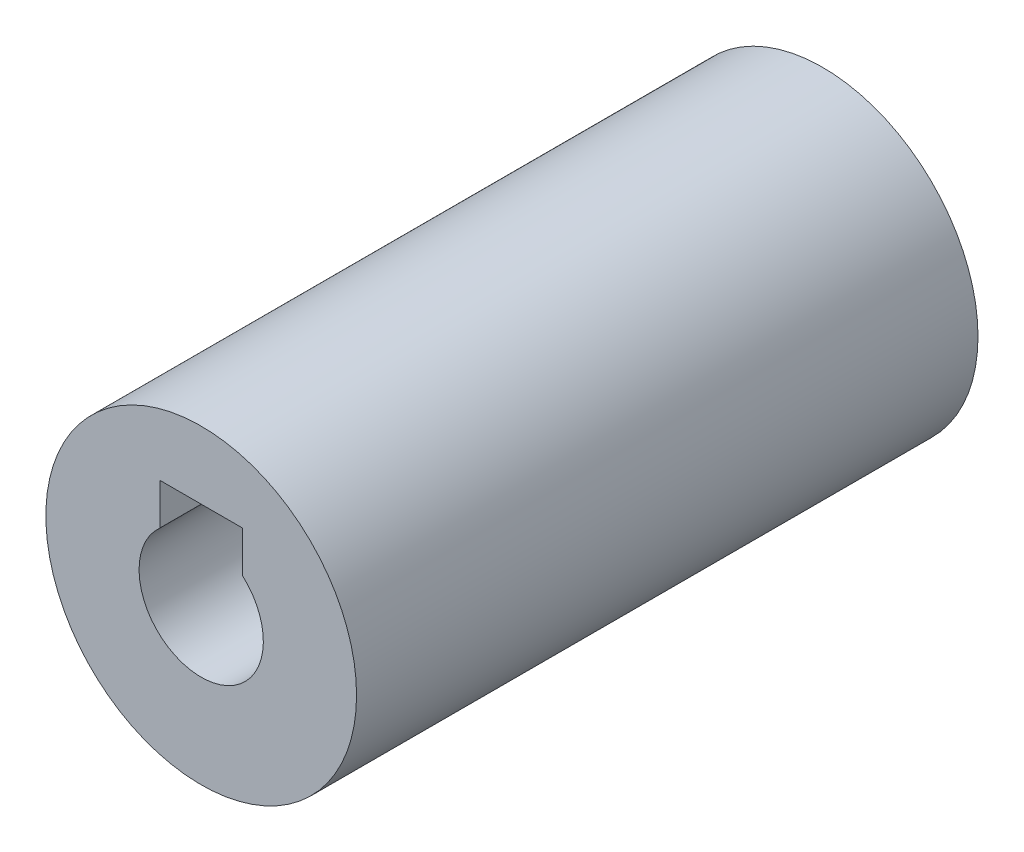
ISO-10303-21;
HEADER;
FILE_DESCRIPTION(('STEP AP214'),'2;1');
FILE_NAME('part.step','',(''),(''),'','','');
FILE_SCHEMA(('AUTOMOTIVE_DESIGN { 1 0 10303 214 1 1 1 1 }'));
ENDSEC;
DATA;
#1=APPLICATION_CONTEXT('core data for automotive mechanical design processes');
#2=APPLICATION_PROTOCOL_DEFINITION('international standard','automotive_design',2000,#1);
#3=PRODUCT_CONTEXT('',#1,'mechanical');
#4=PRODUCT('Part','Part','',(#3));
#5=PRODUCT_RELATED_PRODUCT_CATEGORY('part','',(#4));
#6=PRODUCT_DEFINITION_FORMATION('','',#4);
#7=PRODUCT_DEFINITION_CONTEXT('part definition',#1,'design');
#8=PRODUCT_DEFINITION('design','',#6,#7);
#9=PRODUCT_DEFINITION_SHAPE('','',#8);
#10=(LENGTH_UNIT() NAMED_UNIT(*) SI_UNIT(.MILLI.,.METRE.));
#11=(NAMED_UNIT(*) PLANE_ANGLE_UNIT() SI_UNIT($,.RADIAN.));
#12=(NAMED_UNIT(*) SI_UNIT($,.STERADIAN.) SOLID_ANGLE_UNIT());
#13=UNCERTAINTY_MEASURE_WITH_UNIT(LENGTH_MEASURE(1.E-05),#10,'distance_accuracy_value','');
#14=(GEOMETRIC_REPRESENTATION_CONTEXT(3) GLOBAL_UNCERTAINTY_ASSIGNED_CONTEXT((#13)) GLOBAL_UNIT_ASSIGNED_CONTEXT((#10,
#11,#12)) REPRESENTATION_CONTEXT('',''));
#15=CARTESIAN_POINT('',(0.,0.,0.));
#16=DIRECTION('',(0.,0.,1.));
#17=DIRECTION('',(1.,0.,0.));
#18=AXIS2_PLACEMENT_3D('',#15,#16,#17);
#19=CARTESIAN_POINT('',(0.,0.,30.));
#20=DIRECTION('',(0.,0.,1.));
#21=DIRECTION('',(1.,0.,0.));
#22=AXIS2_PLACEMENT_3D('',#19,#20,#21);
#23=PLANE('',#22);
#24=DIRECTION('',(0.,-1.,0.));
#25=VECTOR('',#24,1.);
#26=CARTESIAN_POINT('',(-2.,0.,30.));
#27=LINE('',#26,#25);
#28=CARTESIAN_POINT('',(-2.,4.23606797749979,30.));
#29=VERTEX_POINT('',#28);
#30=CARTESIAN_POINT('',(-2.,2.23606797749979,30.));
#31=VERTEX_POINT('',#30);
#32=EDGE_CURVE('E83',#29,#31,#27,.T.);
#33=ORIENTED_EDGE('',*,*,#32,.F.);
#34=DIRECTION('',(-1.,0.,0.));
#35=VECTOR('',#34,1.);
#36=CARTESIAN_POINT('',(0.,4.23606797749979,30.));
#37=LINE('',#36,#35);
#38=CARTESIAN_POINT('',(2.,4.23606797749979,30.));
#39=VERTEX_POINT('',#38);
#40=EDGE_CURVE('E107',#39,#29,#37,.T.);
#41=ORIENTED_EDGE('',*,*,#40,.F.);
#42=DIRECTION('',(0.,-1.,0.));
#43=VECTOR('',#42,1.);
#44=CARTESIAN_POINT('',(2.,0.,30.));
#45=LINE('',#44,#43);
#46=CARTESIAN_POINT('',(2.,2.23606797749979,30.));
#47=VERTEX_POINT('',#46);
#48=EDGE_CURVE('E89',#39,#47,#45,.T.);
#49=ORIENTED_EDGE('',*,*,#48,.T.);
#50=CARTESIAN_POINT('',(0.,0.,30.));
#51=DIRECTION('',(0.,0.,1.));
#52=DIRECTION('',(1.,0.,0.));
#53=AXIS2_PLACEMENT_3D('',#50,#51,#52);
#54=CIRCLE('',#53,3.);
#55=EDGE_CURVE('E116',#31,#47,#54,.T.);
#56=ORIENTED_EDGE('',*,*,#55,.F.);
#57=EDGE_LOOP('',(#33,#41,#49,#56));
#58=FACE_BOUND('',#57,.T.);
#59=CARTESIAN_POINT('',(0.,0.,30.));
#60=DIRECTION('',(0.,0.,1.));
#61=DIRECTION('',(1.,0.,0.));
#62=AXIS2_PLACEMENT_3D('',#59,#60,#61);
#63=CIRCLE('',#62,7.5);
#64=CARTESIAN_POINT('',(7.5,0.,30.));
#65=VERTEX_POINT('',#64);
#66=EDGE_CURVE('E11',#65,#65,#63,.T.);
#67=ORIENTED_EDGE('',*,*,#66,.T.);
#68=EDGE_LOOP('',(#67));
#69=FACE_BOUND('',#68,.T.);
#70=ADVANCED_FACE('F43',(#58,#69),#23,.T.);
#71=CARTESIAN_POINT('',(0.,0.,0.));
#72=DIRECTION('',(0.,0.,1.));
#73=DIRECTION('',(1.,0.,0.));
#74=AXIS2_PLACEMENT_3D('',#71,#72,#73);
#75=PLANE('',#74);
#76=CARTESIAN_POINT('',(0.,0.,0.));
#77=DIRECTION('',(0.,0.,1.));
#78=DIRECTION('',(1.,0.,0.));
#79=AXIS2_PLACEMENT_3D('',#76,#77,#78);
#80=CIRCLE('',#79,7.5);
#81=CARTESIAN_POINT('',(7.5,0.,0.));
#82=VERTEX_POINT('',#81);
#83=EDGE_CURVE('E47',#82,#82,#80,.T.);
#84=ORIENTED_EDGE('',*,*,#83,.F.);
#85=EDGE_LOOP('',(#84));
#86=FACE_BOUND('',#85,.T.);
#87=DIRECTION('',(-1.,0.,0.));
#88=VECTOR('',#87,1.);
#89=CARTESIAN_POINT('',(0.,4.23606797749979,0.));
#90=LINE('',#89,#88);
#91=CARTESIAN_POINT('',(2.,4.23606797749979,0.));
#92=VERTEX_POINT('',#91);
#93=CARTESIAN_POINT('',(-2.,4.23606797749979,0.));
#94=VERTEX_POINT('',#93);
#95=EDGE_CURVE('E97',#92,#94,#90,.T.);
#96=ORIENTED_EDGE('',*,*,#95,.T.);
#97=DIRECTION('',(0.,-1.,0.));
#98=VECTOR('',#97,1.);
#99=CARTESIAN_POINT('',(-2.,0.,0.));
#100=LINE('',#99,#98);
#101=CARTESIAN_POINT('',(-2.,2.23606797749979,0.));
#102=VERTEX_POINT('',#101);
#103=EDGE_CURVE('E100',#94,#102,#100,.T.);
#104=ORIENTED_EDGE('',*,*,#103,.T.);
#105=CARTESIAN_POINT('',(0.,0.,0.));
#106=DIRECTION('',(0.,0.,1.));
#107=DIRECTION('',(1.,0.,0.));
#108=AXIS2_PLACEMENT_3D('',#105,#106,#107);
#109=CIRCLE('',#108,3.);
#110=CARTESIAN_POINT('',(2.,2.23606797749979,0.));
#111=VERTEX_POINT('',#110);
#112=EDGE_CURVE('E105',#102,#111,#109,.T.);
#113=ORIENTED_EDGE('',*,*,#112,.T.);
#114=DIRECTION('',(0.,-1.,0.));
#115=VECTOR('',#114,1.);
#116=CARTESIAN_POINT('',(2.,0.,0.));
#117=LINE('',#116,#115);
#118=EDGE_CURVE('E58',#92,#111,#117,.T.);
#119=ORIENTED_EDGE('',*,*,#118,.F.);
#120=EDGE_LOOP('',(#96,#104,#113,#119));
#121=FACE_BOUND('',#120,.T.);
#122=ADVANCED_FACE('F103',(#86,#121),#75,.F.);
#123=CARTESIAN_POINT('',(0.,0.,30.));
#124=DIRECTION('',(0.,0.,-1.));
#125=DIRECTION('',(-1.,0.,0.));
#126=AXIS2_PLACEMENT_3D('',#123,#124,#125);
#127=CYLINDRICAL_SURFACE('',#126,7.5);
#128=ORIENTED_EDGE('',*,*,#66,.F.);
#129=EDGE_LOOP('',(#128));
#130=FACE_BOUND('',#129,.T.);
#131=ORIENTED_EDGE('',*,*,#83,.T.);
#132=EDGE_LOOP('',(#131));
#133=FACE_BOUND('',#132,.T.);
#134=ADVANCED_FACE('F45',(#130,#133),#127,.T.);
#135=CARTESIAN_POINT('',(0.,0.,30.));
#136=DIRECTION('',(0.,0.,-1.));
#137=DIRECTION('',(-1.,0.,0.));
#138=AXIS2_PLACEMENT_3D('',#135,#136,#137);
#139=CYLINDRICAL_SURFACE('',#138,3.);
#140=DIRECTION('',(0.,0.,1.));
#141=VECTOR('',#140,1.);
#142=CARTESIAN_POINT('',(-2.,2.23606797749979,0.));
#143=LINE('',#142,#141);
#144=EDGE_CURVE('E67',#102,#31,#143,.T.);
#145=ORIENTED_EDGE('',*,*,#144,.T.);
#146=ORIENTED_EDGE('',*,*,#55,.T.);
#147=DIRECTION('',(0.,0.,1.));
#148=VECTOR('',#147,1.);
#149=CARTESIAN_POINT('',(2.,2.23606797749979,0.));
#150=LINE('',#149,#148);
#151=EDGE_CURVE('E94',#111,#47,#150,.T.);
#152=ORIENTED_EDGE('',*,*,#151,.F.);
#153=ORIENTED_EDGE('',*,*,#112,.F.);
#154=EDGE_LOOP('',(#145,#146,#152,#153));
#155=FACE_BOUND('',#154,.T.);
#156=ADVANCED_FACE('F131',(#155),#139,.F.);
#157=CARTESIAN_POINT('',(-2.,0.,0.));
#158=DIRECTION('',(-1.,0.,0.));
#159=DIRECTION('',(0.,0.,1.));
#160=AXIS2_PLACEMENT_3D('',#157,#158,#159);
#161=PLANE('',#160);
#162=ORIENTED_EDGE('',*,*,#32,.T.);
#163=ORIENTED_EDGE('',*,*,#144,.F.);
#164=ORIENTED_EDGE('',*,*,#103,.F.);
#165=DIRECTION('',(0.,0.,1.));
#166=VECTOR('',#165,1.);
#167=CARTESIAN_POINT('',(-2.,4.23606797749979,0.));
#168=LINE('',#167,#166);
#169=EDGE_CURVE('E93',#94,#29,#168,.T.);
#170=ORIENTED_EDGE('',*,*,#169,.T.);
#171=EDGE_LOOP('',(#162,#163,#164,#170));
#172=FACE_BOUND('',#171,.T.);
#173=ADVANCED_FACE('F137',(#172),#161,.F.);
#174=CARTESIAN_POINT('',(0.,4.23606797749979,0.));
#175=DIRECTION('',(0.,1.,0.));
#176=DIRECTION('',(0.,0.,1.));
#177=AXIS2_PLACEMENT_3D('',#174,#175,#176);
#178=PLANE('',#177);
#179=ORIENTED_EDGE('',*,*,#40,.T.);
#180=ORIENTED_EDGE('',*,*,#169,.F.);
#181=ORIENTED_EDGE('',*,*,#95,.F.);
#182=DIRECTION('',(0.,0.,1.));
#183=VECTOR('',#182,1.);
#184=CARTESIAN_POINT('',(2.,4.23606797749979,0.));
#185=LINE('',#184,#183);
#186=EDGE_CURVE('E85',#92,#39,#185,.T.);
#187=ORIENTED_EDGE('',*,*,#186,.T.);
#188=EDGE_LOOP('',(#179,#180,#181,#187));
#189=FACE_BOUND('',#188,.T.);
#190=ADVANCED_FACE('F98',(#189),#178,.F.);
#191=CARTESIAN_POINT('',(2.,0.,0.));
#192=DIRECTION('',(-1.,0.,0.));
#193=DIRECTION('',(0.,0.,1.));
#194=AXIS2_PLACEMENT_3D('',#191,#192,#193);
#195=PLANE('',#194);
#196=ORIENTED_EDGE('',*,*,#48,.F.);
#197=ORIENTED_EDGE('',*,*,#186,.F.);
#198=ORIENTED_EDGE('',*,*,#118,.T.);
#199=ORIENTED_EDGE('',*,*,#151,.T.);
#200=EDGE_LOOP('',(#196,#197,#198,#199));
#201=FACE_BOUND('',#200,.T.);
#202=ADVANCED_FACE('F87',(#201),#195,.T.);
#203=CLOSED_SHELL('',(#70,#122,#134,#156,#173,#190,#202));
#204=MANIFOLD_SOLID_BREP('B2',#203);
#205=ADVANCED_BREP_SHAPE_REPRESENTATION('',(#18,#204),#14);
#206=SHAPE_DEFINITION_REPRESENTATION(#9,#205);
ENDSEC;
END-ISO-10303-21;
